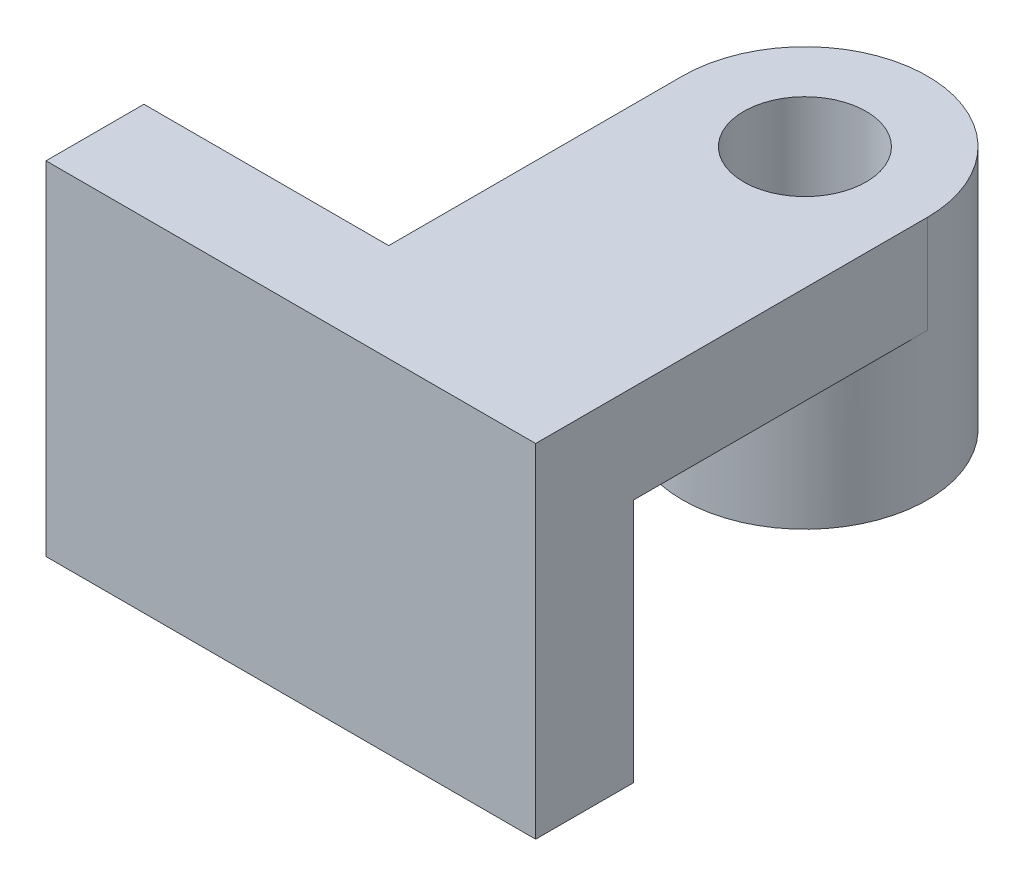
ISO-10303-21;
HEADER;
FILE_DESCRIPTION(('STEP AP214'),'2;1');
FILE_NAME('part.step','',(''),(''),'','','');
FILE_SCHEMA(('AUTOMOTIVE_DESIGN { 1 0 10303 214 1 1 1 1 }'));
ENDSEC;
DATA;
#1=APPLICATION_CONTEXT('core data for automotive mechanical design processes');
#2=APPLICATION_PROTOCOL_DEFINITION('international standard','automotive_design',2000,#1);
#3=PRODUCT_CONTEXT('',#1,'mechanical');
#4=PRODUCT('Part','Part','',(#3));
#5=PRODUCT_RELATED_PRODUCT_CATEGORY('part','',(#4));
#6=PRODUCT_DEFINITION_FORMATION('','',#4);
#7=PRODUCT_DEFINITION_CONTEXT('part definition',#1,'design');
#8=PRODUCT_DEFINITION('design','',#6,#7);
#9=PRODUCT_DEFINITION_SHAPE('','',#8);
#10=(LENGTH_UNIT() NAMED_UNIT(*) SI_UNIT(.MILLI.,.METRE.));
#11=(NAMED_UNIT(*) PLANE_ANGLE_UNIT() SI_UNIT($,.RADIAN.));
#12=(NAMED_UNIT(*) SI_UNIT($,.STERADIAN.) SOLID_ANGLE_UNIT());
#13=UNCERTAINTY_MEASURE_WITH_UNIT(LENGTH_MEASURE(1.E-05),#10,'distance_accuracy_value','');
#14=(GEOMETRIC_REPRESENTATION_CONTEXT(3) GLOBAL_UNCERTAINTY_ASSIGNED_CONTEXT((#13)) GLOBAL_UNIT_ASSIGNED_CONTEXT((#10,
#11,#12)) REPRESENTATION_CONTEXT('',''));
#15=CARTESIAN_POINT('',(0.,0.,0.));
#16=DIRECTION('',(0.,0.,1.));
#17=DIRECTION('',(1.,0.,0.));
#18=AXIS2_PLACEMENT_3D('',#15,#16,#17);
#19=CARTESIAN_POINT('',(63.5,44.45,25.4));
#20=DIRECTION('',(-1.,0.,0.));
#21=DIRECTION('',(0.,0.,1.));
#22=AXIS2_PLACEMENT_3D('',#19,#20,#21);
#23=PLANE('',#22);
#24=DIRECTION('',(0.,0.,-1.));
#25=VECTOR('',#24,1.);
#26=CARTESIAN_POINT('',(63.5,44.45,25.4));
#27=LINE('',#26,#25);
#28=CARTESIAN_POINT('',(63.5,44.45,25.4));
#29=VERTEX_POINT('',#28);
#30=CARTESIAN_POINT('',(63.5,44.45,-76.2));
#31=VERTEX_POINT('',#30);
#32=EDGE_CURVE('E114',#29,#31,#27,.T.);
#33=ORIENTED_EDGE('',*,*,#32,.F.);
#34=DIRECTION('',(0.,1.,0.));
#35=VECTOR('',#34,1.);
#36=CARTESIAN_POINT('',(63.5,44.45,25.4));
#37=LINE('',#36,#35);
#38=CARTESIAN_POINT('',(63.5,-44.45,25.4));
#39=VERTEX_POINT('',#38);
#40=EDGE_CURVE('E83',#39,#29,#37,.T.);
#41=ORIENTED_EDGE('',*,*,#40,.F.);
#42=DIRECTION('',(0.,0.,-1.));
#43=VECTOR('',#42,1.);
#44=CARTESIAN_POINT('',(63.5,-44.45,25.4));
#45=LINE('',#44,#43);
#46=CARTESIAN_POINT('',(63.5,-44.45,0.));
#47=VERTEX_POINT('',#46);
#48=EDGE_CURVE('E136',#39,#47,#45,.T.);
#49=ORIENTED_EDGE('',*,*,#48,.T.);
#50=DIRECTION('',(0.,1.,0.));
#51=VECTOR('',#50,1.);
#52=CARTESIAN_POINT('',(63.5,44.45,0.));
#53=LINE('',#52,#51);
#54=CARTESIAN_POINT('',(63.5,19.05,0.));
#55=VERTEX_POINT('',#54);
#56=EDGE_CURVE('E125',#47,#55,#53,.T.);
#57=ORIENTED_EDGE('',*,*,#56,.T.);
#58=DIRECTION('',(0.,0.,-1.));
#59=VECTOR('',#58,1.);
#60=CARTESIAN_POINT('',(63.5,19.05,25.4));
#61=LINE('',#60,#59);
#62=CARTESIAN_POINT('',(63.5,19.05,-76.2));
#63=VERTEX_POINT('',#62);
#64=EDGE_CURVE('E123',#55,#63,#61,.T.);
#65=ORIENTED_EDGE('',*,*,#64,.T.);
#66=DIRECTION('',(0.,1.,0.));
#67=VECTOR('',#66,1.);
#68=CARTESIAN_POINT('',(63.5,19.05,-76.2));
#69=LINE('',#68,#67);
#70=EDGE_CURVE('E107',#63,#31,#69,.T.);
#71=ORIENTED_EDGE('',*,*,#70,.T.);
#72=EDGE_LOOP('',(#33,#41,#49,#57,#65,#71));
#73=FACE_BOUND('',#72,.T.);
#74=ADVANCED_FACE('F37',(#73),#23,.F.);
#75=CARTESIAN_POINT('',(-63.5,44.45,25.4));
#76=DIRECTION('',(0.,-1.,0.));
#77=DIRECTION('',(0.,0.,-1.));
#78=AXIS2_PLACEMENT_3D('',#75,#76,#77);
#79=PLANE('',#78);
#80=CARTESIAN_POINT('',(31.75,44.45,-76.1999999999999));
#81=DIRECTION('',(0.,1.,0.));
#82=DIRECTION('',(0.,0.,1.));
#83=AXIS2_PLACEMENT_3D('',#80,#81,#82);
#84=CIRCLE('',#83,15.875);
#85=CARTESIAN_POINT('',(31.75,44.45,-60.3249999999999));
#86=VERTEX_POINT('',#85);
#87=EDGE_CURVE('E187',#86,#86,#84,.T.);
#88=ORIENTED_EDGE('',*,*,#87,.F.);
#89=EDGE_LOOP('',(#88));
#90=FACE_BOUND('',#89,.T.);
#91=ORIENTED_EDGE('',*,*,#32,.T.);
#92=CARTESIAN_POINT('',(31.75,44.45,-76.2));
#93=DIRECTION('',(0.,1.,0.));
#94=DIRECTION('',(0.,0.,1.));
#95=AXIS2_PLACEMENT_3D('',#92,#93,#94);
#96=CIRCLE('',#95,31.75);
#97=CARTESIAN_POINT('',(0.,44.45,-76.2));
#98=VERTEX_POINT('',#97);
#99=EDGE_CURVE('E103',#31,#98,#96,.T.);
#100=ORIENTED_EDGE('',*,*,#99,.T.);
#101=DIRECTION('',(0.,0.,1.));
#102=VECTOR('',#101,1.);
#103=CARTESIAN_POINT('',(0.,44.45,-76.2));
#104=LINE('',#103,#102);
#105=CARTESIAN_POINT('',(0.,44.45,0.));
#106=VERTEX_POINT('',#105);
#107=EDGE_CURVE('E52',#98,#106,#104,.T.);
#108=ORIENTED_EDGE('',*,*,#107,.T.);
#109=DIRECTION('',(-1.,0.,0.));
#110=VECTOR('',#109,1.);
#111=CARTESIAN_POINT('',(-63.5,44.45,0.));
#112=LINE('',#111,#110);
#113=CARTESIAN_POINT('',(-63.5,44.45,0.));
#114=VERTEX_POINT('',#113);
#115=EDGE_CURVE('E138',#106,#114,#112,.T.);
#116=ORIENTED_EDGE('',*,*,#115,.T.);
#117=DIRECTION('',(0.,0.,-1.));
#118=VECTOR('',#117,1.);
#119=CARTESIAN_POINT('',(-63.5,44.45,25.4));
#120=LINE('',#119,#118);
#121=CARTESIAN_POINT('',(-63.5,44.45,25.4));
#122=VERTEX_POINT('',#121);
#123=EDGE_CURVE('E119',#122,#114,#120,.T.);
#124=ORIENTED_EDGE('',*,*,#123,.F.);
#125=DIRECTION('',(-1.,0.,0.));
#126=VECTOR('',#125,1.);
#127=CARTESIAN_POINT('',(-63.5,44.45,25.4));
#128=LINE('',#127,#126);
#129=EDGE_CURVE('E117',#29,#122,#128,.T.);
#130=ORIENTED_EDGE('',*,*,#129,.F.);
#131=EDGE_LOOP('',(#91,#100,#108,#116,#124,#130));
#132=FACE_BOUND('',#131,.T.);
#133=ADVANCED_FACE('F115',(#90,#132),#79,.F.);
#134=CARTESIAN_POINT('',(-63.5,44.45,25.4));
#135=DIRECTION('',(1.,0.,0.));
#136=DIRECTION('',(0.,1.,0.));
#137=AXIS2_PLACEMENT_3D('',#134,#135,#136);
#138=PLANE('',#137);
#139=DIRECTION('',(0.,-1.,0.));
#140=VECTOR('',#139,1.);
#141=CARTESIAN_POINT('',(-63.5,44.45,0.));
#142=LINE('',#141,#140);
#143=CARTESIAN_POINT('',(-63.5,-44.45,0.));
#144=VERTEX_POINT('',#143);
#145=EDGE_CURVE('E140',#114,#144,#142,.T.);
#146=ORIENTED_EDGE('',*,*,#145,.T.);
#147=DIRECTION('',(0.,0.,-1.));
#148=VECTOR('',#147,1.);
#149=CARTESIAN_POINT('',(-63.5,-44.45,25.4));
#150=LINE('',#149,#148);
#151=CARTESIAN_POINT('',(-63.5,-44.45,25.4));
#152=VERTEX_POINT('',#151);
#153=EDGE_CURVE('E144',#152,#144,#150,.T.);
#154=ORIENTED_EDGE('',*,*,#153,.F.);
#155=DIRECTION('',(0.,-1.,0.));
#156=VECTOR('',#155,1.);
#157=CARTESIAN_POINT('',(-63.5,44.45,25.4));
#158=LINE('',#157,#156);
#159=EDGE_CURVE('E133',#122,#152,#158,.T.);
#160=ORIENTED_EDGE('',*,*,#159,.F.);
#161=ORIENTED_EDGE('',*,*,#123,.T.);
#162=EDGE_LOOP('',(#146,#154,#160,#161));
#163=FACE_BOUND('',#162,.T.);
#164=ADVANCED_FACE('F163',(#163),#138,.F.);
#165=CARTESIAN_POINT('',(-63.5,-44.45,25.4));
#166=DIRECTION('',(0.,1.,0.));
#167=DIRECTION('',(0.,0.,1.));
#168=AXIS2_PLACEMENT_3D('',#165,#166,#167);
#169=PLANE('',#168);
#170=DIRECTION('',(1.,0.,0.));
#171=VECTOR('',#170,1.);
#172=CARTESIAN_POINT('',(-63.5,-44.45,0.));
#173=LINE('',#172,#171);
#174=EDGE_CURVE('E78',#144,#47,#173,.T.);
#175=ORIENTED_EDGE('',*,*,#174,.T.);
#176=ORIENTED_EDGE('',*,*,#48,.F.);
#177=DIRECTION('',(1.,0.,0.));
#178=VECTOR('',#177,1.);
#179=CARTESIAN_POINT('',(-63.5,-44.45,25.4));
#180=LINE('',#179,#178);
#181=EDGE_CURVE('E61',#152,#39,#180,.T.);
#182=ORIENTED_EDGE('',*,*,#181,.F.);
#183=ORIENTED_EDGE('',*,*,#153,.T.);
#184=EDGE_LOOP('',(#175,#176,#182,#183));
#185=FACE_BOUND('',#184,.T.);
#186=ADVANCED_FACE('F167',(#185),#169,.F.);
#187=CARTESIAN_POINT('',(0.,0.,25.4));
#188=DIRECTION('',(0.,0.,1.));
#189=DIRECTION('',(1.,0.,0.));
#190=AXIS2_PLACEMENT_3D('',#187,#188,#189);
#191=PLANE('',#190);
#192=ORIENTED_EDGE('',*,*,#129,.T.);
#193=ORIENTED_EDGE('',*,*,#159,.T.);
#194=ORIENTED_EDGE('',*,*,#181,.T.);
#195=ORIENTED_EDGE('',*,*,#40,.T.);
#196=EDGE_LOOP('',(#192,#193,#194,#195));
#197=FACE_BOUND('',#196,.T.);
#198=ADVANCED_FACE('F165',(#197),#191,.T.);
#199=CARTESIAN_POINT('',(0.,0.,0.));
#200=DIRECTION('',(0.,0.,1.));
#201=DIRECTION('',(1.,0.,0.));
#202=AXIS2_PLACEMENT_3D('',#199,#200,#201);
#203=PLANE('',#202);
#204=ORIENTED_EDGE('',*,*,#115,.F.);
#205=DIRECTION('',(0.,-1.,0.));
#206=VECTOR('',#205,1.);
#207=CARTESIAN_POINT('',(0.,0.,0.));
#208=LINE('',#207,#206);
#209=CARTESIAN_POINT('',(0.,19.05,0.));
#210=VERTEX_POINT('',#209);
#211=EDGE_CURVE('E11',#106,#210,#208,.T.);
#212=ORIENTED_EDGE('',*,*,#211,.T.);
#213=DIRECTION('',(-1.,0.,0.));
#214=VECTOR('',#213,1.);
#215=CARTESIAN_POINT('',(0.,19.05,0.));
#216=LINE('',#215,#214);
#217=EDGE_CURVE('E45',#55,#210,#216,.T.);
#218=ORIENTED_EDGE('',*,*,#217,.F.);
#219=ORIENTED_EDGE('',*,*,#56,.F.);
#220=ORIENTED_EDGE('',*,*,#174,.F.);
#221=ORIENTED_EDGE('',*,*,#145,.F.);
#222=EDGE_LOOP('',(#204,#212,#218,#219,#220,#221));
#223=FACE_BOUND('',#222,.T.);
#224=ADVANCED_FACE('F159',(#223),#203,.F.);
#225=CARTESIAN_POINT('',(0.,19.05,-76.2));
#226=DIRECTION('',(-1.,0.,0.));
#227=DIRECTION('',(0.,0.,1.));
#228=AXIS2_PLACEMENT_3D('',#225,#226,#227);
#229=PLANE('',#228);
#230=ORIENTED_EDGE('',*,*,#211,.F.);
#231=ORIENTED_EDGE('',*,*,#107,.F.);
#232=DIRECTION('',(0.,1.,0.));
#233=VECTOR('',#232,1.);
#234=CARTESIAN_POINT('',(0.,19.05,-76.2));
#235=LINE('',#234,#233);
#236=CARTESIAN_POINT('',(0.,19.05,-76.2));
#237=VERTEX_POINT('',#236);
#238=EDGE_CURVE('E110',#237,#98,#235,.T.);
#239=ORIENTED_EDGE('',*,*,#238,.F.);
#240=DIRECTION('',(0.,0.,1.));
#241=VECTOR('',#240,1.);
#242=CARTESIAN_POINT('',(0.,19.05,-76.2));
#243=LINE('',#242,#241);
#244=EDGE_CURVE('E127',#237,#210,#243,.T.);
#245=ORIENTED_EDGE('',*,*,#244,.T.);
#246=EDGE_LOOP('',(#230,#231,#239,#245));
#247=FACE_BOUND('',#246,.T.);
#248=ADVANCED_FACE('F156',(#247),#229,.T.);
#249=CARTESIAN_POINT('',(0.,19.05,0.));
#250=DIRECTION('',(0.,1.,0.));
#251=DIRECTION('',(0.,0.,1.));
#252=AXIS2_PLACEMENT_3D('',#249,#250,#251);
#253=PLANE('',#252);
#254=ORIENTED_EDGE('',*,*,#244,.F.);
#255=CARTESIAN_POINT('',(31.75,19.05,-76.2));
#256=DIRECTION('',(0.,1.,0.));
#257=DIRECTION('',(0.,0.,1.));
#258=AXIS2_PLACEMENT_3D('',#255,#256,#257);
#259=CIRCLE('',#258,31.75);
#260=EDGE_CURVE('E193',#237,#63,#259,.T.);
#261=ORIENTED_EDGE('',*,*,#260,.T.);
#262=ORIENTED_EDGE('',*,*,#64,.F.);
#263=ORIENTED_EDGE('',*,*,#217,.T.);
#264=EDGE_LOOP('',(#254,#261,#262,#263));
#265=FACE_BOUND('',#264,.T.);
#266=ADVANCED_FACE('F152',(#265),#253,.F.);
#267=CARTESIAN_POINT('',(31.75,-19.05,-76.2));
#268=DIRECTION('',(0.,1.,0.));
#269=DIRECTION('',(0.,0.,1.));
#270=AXIS2_PLACEMENT_3D('',#267,#268,#269);
#271=CYLINDRICAL_SURFACE('',#270,31.75);
#272=CARTESIAN_POINT('',(31.75,-19.05,-76.2));
#273=DIRECTION('',(0.,1.,0.));
#274=DIRECTION('',(0.,0.,1.));
#275=AXIS2_PLACEMENT_3D('',#272,#273,#274);
#276=CIRCLE('',#275,31.75);
#277=CARTESIAN_POINT('',(31.75,-19.05,-44.45));
#278=VERTEX_POINT('',#277);
#279=EDGE_CURVE('E111',#278,#278,#276,.T.);
#280=ORIENTED_EDGE('',*,*,#279,.T.);
#281=EDGE_LOOP('',(#280));
#282=FACE_BOUND('',#281,.T.);
#283=ORIENTED_EDGE('',*,*,#260,.F.);
#284=ORIENTED_EDGE('',*,*,#238,.T.);
#285=ORIENTED_EDGE('',*,*,#99,.F.);
#286=ORIENTED_EDGE('',*,*,#70,.F.);
#287=EDGE_LOOP('',(#283,#284,#285,#286));
#288=FACE_BOUND('',#287,.T.);
#289=ADVANCED_FACE('F105',(#282,#288),#271,.T.);
#290=CARTESIAN_POINT('',(31.75,-19.05,-76.2));
#291=DIRECTION('',(0.,1.,0.));
#292=DIRECTION('',(0.,0.,1.));
#293=AXIS2_PLACEMENT_3D('',#290,#291,#292);
#294=PLANE('',#293);
#295=CARTESIAN_POINT('',(31.75,-19.05,-76.1999999999999));
#296=DIRECTION('',(0.,1.,0.));
#297=DIRECTION('',(0.,0.,1.));
#298=AXIS2_PLACEMENT_3D('',#295,#296,#297);
#299=CIRCLE('',#298,15.875);
#300=CARTESIAN_POINT('',(31.75,-19.05,-60.3249999999999));
#301=VERTEX_POINT('',#300);
#302=EDGE_CURVE('E40',#301,#301,#299,.T.);
#303=ORIENTED_EDGE('',*,*,#302,.T.);
#304=EDGE_LOOP('',(#303));
#305=FACE_BOUND('',#304,.T.);
#306=ORIENTED_EDGE('',*,*,#279,.F.);
#307=EDGE_LOOP('',(#306));
#308=FACE_BOUND('',#307,.T.);
#309=ADVANCED_FACE('F198',(#305,#308),#294,.F.);
#310=CARTESIAN_POINT('',(31.75,-44.45,-76.1999999999999));
#311=DIRECTION('',(0.,1.,0.));
#312=DIRECTION('',(0.,0.,1.));
#313=AXIS2_PLACEMENT_3D('',#310,#311,#312);
#314=CYLINDRICAL_SURFACE('',#313,15.875);
#315=ORIENTED_EDGE('',*,*,#87,.T.);
#316=EDGE_LOOP('',(#315));
#317=FACE_BOUND('',#316,.T.);
#318=ORIENTED_EDGE('',*,*,#302,.F.);
#319=EDGE_LOOP('',(#318));
#320=FACE_BOUND('',#319,.T.);
#321=ADVANCED_FACE('F200',(#317,#320),#314,.F.);
#322=CLOSED_SHELL('',(#74,#133,#164,#186,#198,#224,#248,#266,#289,#309,#321));
#323=MANIFOLD_SOLID_BREP('B2',#322);
#324=ADVANCED_BREP_SHAPE_REPRESENTATION('',(#18,#323),#14);
#325=SHAPE_DEFINITION_REPRESENTATION(#9,#324);
ENDSEC;
END-ISO-10303-21;
